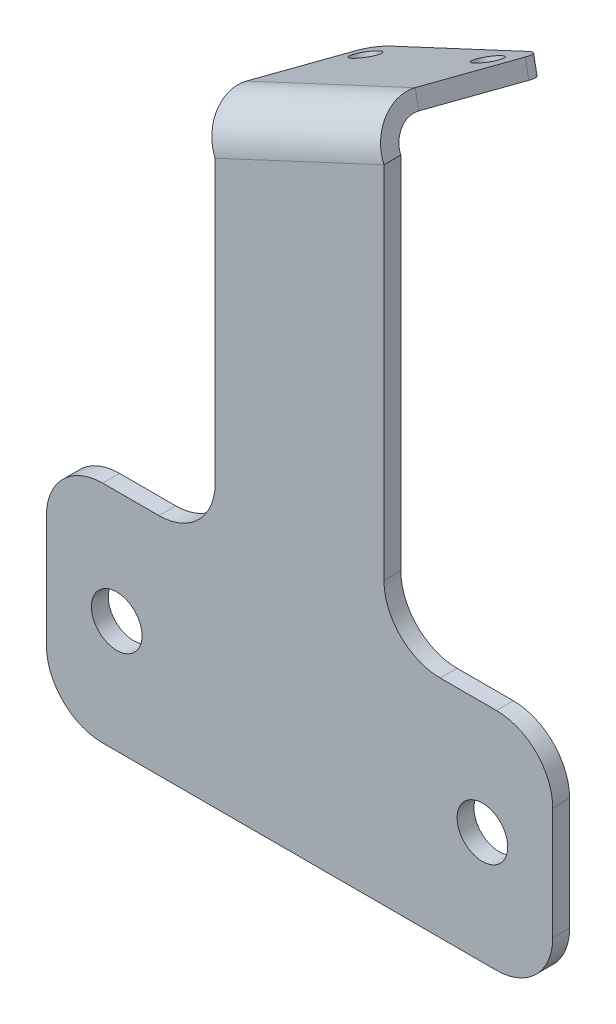
ISO-10303-21;
HEADER;
FILE_DESCRIPTION(('STEP AP214'),'2;1');
FILE_NAME('part.step','',(''),(''),'','','');
FILE_SCHEMA(('AUTOMOTIVE_DESIGN { 1 0 10303 214 1 1 1 1 }'));
ENDSEC;
DATA;
#1=APPLICATION_CONTEXT('core data for automotive mechanical design processes');
#2=APPLICATION_PROTOCOL_DEFINITION('international standard','automotive_design',2000,#1);
#3=PRODUCT_CONTEXT('',#1,'mechanical');
#4=PRODUCT('Part','Part','',(#3));
#5=PRODUCT_RELATED_PRODUCT_CATEGORY('part','',(#4));
#6=PRODUCT_DEFINITION_FORMATION('','',#4);
#7=PRODUCT_DEFINITION_CONTEXT('part definition',#1,'design');
#8=PRODUCT_DEFINITION('design','',#6,#7);
#9=PRODUCT_DEFINITION_SHAPE('','',#8);
#10=(LENGTH_UNIT() NAMED_UNIT(*) SI_UNIT(.MILLI.,.METRE.));
#11=(NAMED_UNIT(*) PLANE_ANGLE_UNIT() SI_UNIT($,.RADIAN.));
#12=(NAMED_UNIT(*) SI_UNIT($,.STERADIAN.) SOLID_ANGLE_UNIT());
#13=UNCERTAINTY_MEASURE_WITH_UNIT(LENGTH_MEASURE(1.E-05),#10,'distance_accuracy_value','');
#14=(GEOMETRIC_REPRESENTATION_CONTEXT(3) GLOBAL_UNCERTAINTY_ASSIGNED_CONTEXT((#13)) GLOBAL_UNIT_ASSIGNED_CONTEXT((#10,
#11,#12)) REPRESENTATION_CONTEXT('',''));
#15=CARTESIAN_POINT('',(0.,0.,0.));
#16=DIRECTION('',(0.,0.,1.));
#17=DIRECTION('',(1.,0.,0.));
#18=AXIS2_PLACEMENT_3D('',#15,#16,#17);
#19=CARTESIAN_POINT('',(15.,40.,-3.));
#20=DIRECTION('',(1.,0.,0.));
#21=DIRECTION('',(0.,0.,1.));
#22=AXIS2_PLACEMENT_3D('',#19,#20,#21);
#23=PLANE('',#22);
#24=DIRECTION('',(0.,-1.,0.));
#25=VECTOR('',#24,1.);
#26=CARTESIAN_POINT('',(15.,40.,-3.));
#27=LINE('',#26,#25);
#28=CARTESIAN_POINT('',(15.,114.,-3.));
#29=VERTEX_POINT('',#28);
#30=CARTESIAN_POINT('',(15.,50.,-3.));
#31=VERTEX_POINT('',#30);
#32=EDGE_CURVE('E245',#29,#31,#27,.T.);
#33=ORIENTED_EDGE('',*,*,#32,.F.);
#34=DIRECTION('',(0.,0.,1.));
#35=VECTOR('',#34,1.);
#36=CARTESIAN_POINT('',(15.,114.,-3.));
#37=LINE('',#36,#35);
#38=CARTESIAN_POINT('',(15.,114.,0.));
#39=VERTEX_POINT('',#38);
#40=EDGE_CURVE('E267',#29,#39,#37,.T.);
#41=ORIENTED_EDGE('',*,*,#40,.T.);
#42=DIRECTION('',(0.,-1.,0.));
#43=VECTOR('',#42,1.);
#44=CARTESIAN_POINT('',(15.,40.,0.));
#45=LINE('',#44,#43);
#46=CARTESIAN_POINT('',(15.,50.,0.));
#47=VERTEX_POINT('',#46);
#48=EDGE_CURVE('E244',#39,#47,#45,.T.);
#49=ORIENTED_EDGE('',*,*,#48,.T.);
#50=DIRECTION('',(0.,0.,1.));
#51=VECTOR('',#50,1.);
#52=CARTESIAN_POINT('',(15.,50.,0.));
#53=LINE('',#52,#51);
#54=EDGE_CURVE('E337',#31,#47,#53,.T.);
#55=ORIENTED_EDGE('',*,*,#54,.F.);
#56=EDGE_LOOP('',(#33,#41,#49,#55));
#57=FACE_BOUND('',#56,.T.);
#58=ADVANCED_FACE('F45',(#57),#23,.T.);
#59=CARTESIAN_POINT('',(-15.,40.,-3.));
#60=DIRECTION('',(-1.,0.,0.));
#61=DIRECTION('',(0.,1.,0.));
#62=AXIS2_PLACEMENT_3D('',#59,#60,#61);
#63=PLANE('',#62);
#64=DIRECTION('',(0.,1.,0.));
#65=VECTOR('',#64,1.);
#66=CARTESIAN_POINT('',(-15.,40.,0.));
#67=LINE('',#66,#65);
#68=CARTESIAN_POINT('',(-15.,50.,0.));
#69=VERTEX_POINT('',#68);
#70=CARTESIAN_POINT('',(-15.,100.01077025535,0.));
#71=VERTEX_POINT('',#70);
#72=EDGE_CURVE('E249',#69,#71,#67,.T.);
#73=ORIENTED_EDGE('',*,*,#72,.T.);
#74=DIRECTION('',(0.,0.,1.));
#75=VECTOR('',#74,1.);
#76=CARTESIAN_POINT('',(-15.,100.01077025535,-3.));
#77=LINE('',#76,#75);
#78=CARTESIAN_POINT('',(-15.,100.01077025535,-3.));
#79=VERTEX_POINT('',#78);
#80=EDGE_CURVE('E216',#79,#71,#77,.T.);
#81=ORIENTED_EDGE('',*,*,#80,.F.);
#82=DIRECTION('',(0.,1.,0.));
#83=VECTOR('',#82,1.);
#84=CARTESIAN_POINT('',(-15.,40.,-3.));
#85=LINE('',#84,#83);
#86=CARTESIAN_POINT('',(-15.,50.,-3.));
#87=VERTEX_POINT('',#86);
#88=EDGE_CURVE('E264',#87,#79,#85,.T.);
#89=ORIENTED_EDGE('',*,*,#88,.F.);
#90=DIRECTION('',(0.,0.,1.));
#91=VECTOR('',#90,1.);
#92=CARTESIAN_POINT('',(-15.,50.,-3.));
#93=LINE('',#92,#91);
#94=EDGE_CURVE('E334',#69,#87,#93,.F.);
#95=ORIENTED_EDGE('',*,*,#94,.F.);
#96=EDGE_LOOP('',(#73,#81,#89,#95));
#97=FACE_BOUND('',#96,.T.);
#98=ADVANCED_FACE('F411',(#97),#63,.T.);
#99=CARTESIAN_POINT('',(-45.,40.,-3.));
#100=DIRECTION('',(0.,1.,0.));
#101=DIRECTION('',(1.,0.,0.));
#102=AXIS2_PLACEMENT_3D('',#99,#100,#101);
#103=PLANE('',#102);
#104=DIRECTION('',(1.,0.,0.));
#105=VECTOR('',#104,1.);
#106=CARTESIAN_POINT('',(-45.,40.,0.));
#107=LINE('',#106,#105);
#108=CARTESIAN_POINT('',(-35.,40.,0.));
#109=VERTEX_POINT('',#108);
#110=CARTESIAN_POINT('',(-25.,40.,0.));
#111=VERTEX_POINT('',#110);
#112=EDGE_CURVE('E282',#109,#111,#107,.T.);
#113=ORIENTED_EDGE('',*,*,#112,.T.);
#114=DIRECTION('',(0.,0.,1.));
#115=VECTOR('',#114,1.);
#116=CARTESIAN_POINT('',(-25.,40.,0.));
#117=LINE('',#116,#115);
#118=CARTESIAN_POINT('',(-25.,40.,-3.));
#119=VERTEX_POINT('',#118);
#120=EDGE_CURVE('E322',#119,#111,#117,.T.);
#121=ORIENTED_EDGE('',*,*,#120,.F.);
#122=DIRECTION('',(1.,0.,0.));
#123=VECTOR('',#122,1.);
#124=CARTESIAN_POINT('',(-45.,40.,-3.));
#125=LINE('',#124,#123);
#126=CARTESIAN_POINT('',(-35.,40.,-3.));
#127=VERTEX_POINT('',#126);
#128=EDGE_CURVE('E261',#127,#119,#125,.T.);
#129=ORIENTED_EDGE('',*,*,#128,.F.);
#130=DIRECTION('',(0.,0.,1.));
#131=VECTOR('',#130,1.);
#132=CARTESIAN_POINT('',(-35.,40.,-3.));
#133=LINE('',#132,#131);
#134=EDGE_CURVE('E325',#109,#127,#133,.F.);
#135=ORIENTED_EDGE('',*,*,#134,.F.);
#136=EDGE_LOOP('',(#113,#121,#129,#135));
#137=FACE_BOUND('',#136,.T.);
#138=ADVANCED_FACE('F417',(#137),#103,.T.);
#139=CARTESIAN_POINT('',(-45.,0.,-3.));
#140=DIRECTION('',(-1.,0.,0.));
#141=DIRECTION('',(0.,1.,0.));
#142=AXIS2_PLACEMENT_3D('',#139,#140,#141);
#143=PLANE('',#142);
#144=DIRECTION('',(0.,1.,0.));
#145=VECTOR('',#144,1.);
#146=CARTESIAN_POINT('',(-45.,0.,0.));
#147=LINE('',#146,#145);
#148=CARTESIAN_POINT('',(-45.,10.,0.));
#149=VERTEX_POINT('',#148);
#150=CARTESIAN_POINT('',(-45.,30.,0.));
#151=VERTEX_POINT('',#150);
#152=EDGE_CURVE('E279',#149,#151,#147,.T.);
#153=ORIENTED_EDGE('',*,*,#152,.T.);
#154=DIRECTION('',(0.,0.,1.));
#155=VECTOR('',#154,1.);
#156=CARTESIAN_POINT('',(-45.,30.,-3.));
#157=LINE('',#156,#155);
#158=CARTESIAN_POINT('',(-45.,30.,-3.));
#159=VERTEX_POINT('',#158);
#160=EDGE_CURVE('E316',#159,#151,#157,.T.);
#161=ORIENTED_EDGE('',*,*,#160,.F.);
#162=DIRECTION('',(0.,1.,0.));
#163=VECTOR('',#162,1.);
#164=CARTESIAN_POINT('',(-45.,0.,-3.));
#165=LINE('',#164,#163);
#166=CARTESIAN_POINT('',(-45.,10.,-3.));
#167=VERTEX_POINT('',#166);
#168=EDGE_CURVE('E258',#167,#159,#165,.T.);
#169=ORIENTED_EDGE('',*,*,#168,.F.);
#170=DIRECTION('',(0.,0.,1.));
#171=VECTOR('',#170,1.);
#172=CARTESIAN_POINT('',(-45.,10.,-3.));
#173=LINE('',#172,#171);
#174=EDGE_CURVE('E319',#149,#167,#173,.F.);
#175=ORIENTED_EDGE('',*,*,#174,.F.);
#176=EDGE_LOOP('',(#153,#161,#169,#175));
#177=FACE_BOUND('',#176,.T.);
#178=ADVANCED_FACE('F493',(#177),#143,.T.);
#179=CARTESIAN_POINT('',(45.,0.,-3.));
#180=DIRECTION('',(0.,-1.,0.));
#181=DIRECTION('',(-1.,0.,0.));
#182=AXIS2_PLACEMENT_3D('',#179,#180,#181);
#183=PLANE('',#182);
#184=DIRECTION('',(-1.,0.,0.));
#185=VECTOR('',#184,1.);
#186=CARTESIAN_POINT('',(45.,0.,0.));
#187=LINE('',#186,#185);
#188=CARTESIAN_POINT('',(35.,0.,0.));
#189=VERTEX_POINT('',#188);
#190=CARTESIAN_POINT('',(-35.,0.,0.));
#191=VERTEX_POINT('',#190);
#192=EDGE_CURVE('E276',#189,#191,#187,.T.);
#193=ORIENTED_EDGE('',*,*,#192,.T.);
#194=DIRECTION('',(0.,0.,1.));
#195=VECTOR('',#194,1.);
#196=CARTESIAN_POINT('',(-35.,0.,-3.));
#197=LINE('',#196,#195);
#198=CARTESIAN_POINT('',(-35.,0.,-3.));
#199=VERTEX_POINT('',#198);
#200=EDGE_CURVE('E302',#199,#191,#197,.T.);
#201=ORIENTED_EDGE('',*,*,#200,.F.);
#202=DIRECTION('',(-1.,0.,0.));
#203=VECTOR('',#202,1.);
#204=CARTESIAN_POINT('',(45.,0.,-3.));
#205=LINE('',#204,#203);
#206=CARTESIAN_POINT('',(35.,0.,-3.));
#207=VERTEX_POINT('',#206);
#208=EDGE_CURVE('E255',#207,#199,#205,.T.);
#209=ORIENTED_EDGE('',*,*,#208,.F.);
#210=DIRECTION('',(0.,0.,1.));
#211=VECTOR('',#210,1.);
#212=CARTESIAN_POINT('',(35.,0.,-3.));
#213=LINE('',#212,#211);
#214=EDGE_CURVE('E305',#189,#207,#213,.F.);
#215=ORIENTED_EDGE('',*,*,#214,.F.);
#216=EDGE_LOOP('',(#193,#201,#209,#215));
#217=FACE_BOUND('',#216,.T.);
#218=ADVANCED_FACE('F486',(#217),#183,.T.);
#219=CARTESIAN_POINT('',(45.,0.,-3.));
#220=DIRECTION('',(1.,0.,0.));
#221=DIRECTION('',(0.,-1.,0.));
#222=AXIS2_PLACEMENT_3D('',#219,#220,#221);
#223=PLANE('',#222);
#224=DIRECTION('',(0.,-1.,0.));
#225=VECTOR('',#224,1.);
#226=CARTESIAN_POINT('',(45.,0.,-3.));
#227=LINE('',#226,#225);
#228=CARTESIAN_POINT('',(45.,30.,-3.));
#229=VERTEX_POINT('',#228);
#230=CARTESIAN_POINT('',(45.,10.,-3.));
#231=VERTEX_POINT('',#230);
#232=EDGE_CURVE('E252',#229,#231,#227,.T.);
#233=ORIENTED_EDGE('',*,*,#232,.F.);
#234=DIRECTION('',(0.,0.,1.));
#235=VECTOR('',#234,1.);
#236=CARTESIAN_POINT('',(45.,30.,-3.));
#237=LINE('',#236,#235);
#238=CARTESIAN_POINT('',(45.,30.,0.));
#239=VERTEX_POINT('',#238);
#240=EDGE_CURVE('E288',#239,#229,#237,.F.);
#241=ORIENTED_EDGE('',*,*,#240,.F.);
#242=DIRECTION('',(0.,-1.,0.));
#243=VECTOR('',#242,1.);
#244=CARTESIAN_POINT('',(45.,0.,0.));
#245=LINE('',#244,#243);
#246=CARTESIAN_POINT('',(45.,10.,0.));
#247=VERTEX_POINT('',#246);
#248=EDGE_CURVE('E273',#239,#247,#245,.T.);
#249=ORIENTED_EDGE('',*,*,#248,.T.);
#250=DIRECTION('',(0.,0.,1.));
#251=VECTOR('',#250,1.);
#252=CARTESIAN_POINT('',(45.,10.,-3.));
#253=LINE('',#252,#251);
#254=EDGE_CURVE('E291',#231,#247,#253,.T.);
#255=ORIENTED_EDGE('',*,*,#254,.F.);
#256=EDGE_LOOP('',(#233,#241,#249,#255));
#257=FACE_BOUND('',#256,.T.);
#258=ADVANCED_FACE('F481',(#257),#223,.T.);
#259=CARTESIAN_POINT('',(45.,40.,-3.));
#260=DIRECTION('',(0.,1.,0.));
#261=DIRECTION('',(0.,0.,1.));
#262=AXIS2_PLACEMENT_3D('',#259,#260,#261);
#263=PLANE('',#262);
#264=DIRECTION('',(1.,0.,0.));
#265=VECTOR('',#264,1.);
#266=CARTESIAN_POINT('',(45.,40.,-3.));
#267=LINE('',#266,#265);
#268=CARTESIAN_POINT('',(25.,40.,-3.));
#269=VERTEX_POINT('',#268);
#270=CARTESIAN_POINT('',(35.,40.,-3.));
#271=VERTEX_POINT('',#270);
#272=EDGE_CURVE('E248',#269,#271,#267,.T.);
#273=ORIENTED_EDGE('',*,*,#272,.F.);
#274=DIRECTION('',(0.,0.,1.));
#275=VECTOR('',#274,1.);
#276=CARTESIAN_POINT('',(25.,40.,-3.));
#277=LINE('',#276,#275);
#278=CARTESIAN_POINT('',(25.,40.,0.));
#279=VERTEX_POINT('',#278);
#280=EDGE_CURVE('E328',#279,#269,#277,.F.);
#281=ORIENTED_EDGE('',*,*,#280,.F.);
#282=DIRECTION('',(1.,0.,0.));
#283=VECTOR('',#282,1.);
#284=CARTESIAN_POINT('',(45.,40.,0.));
#285=LINE('',#284,#283);
#286=CARTESIAN_POINT('',(35.,40.,0.));
#287=VERTEX_POINT('',#286);
#288=EDGE_CURVE('E270',#279,#287,#285,.T.);
#289=ORIENTED_EDGE('',*,*,#288,.T.);
#290=DIRECTION('',(0.,0.,1.));
#291=VECTOR('',#290,1.);
#292=CARTESIAN_POINT('',(35.,40.,-3.));
#293=LINE('',#292,#291);
#294=EDGE_CURVE('E331',#271,#287,#293,.T.);
#295=ORIENTED_EDGE('',*,*,#294,.F.);
#296=EDGE_LOOP('',(#273,#281,#289,#295));
#297=FACE_BOUND('',#296,.T.);
#298=ADVANCED_FACE('F422',(#297),#263,.T.);
#299=CARTESIAN_POINT('',(0.,0.,-3.));
#300=DIRECTION('',(0.,0.,1.));
#301=DIRECTION('',(-1.,0.,0.));
#302=AXIS2_PLACEMENT_3D('',#299,#300,#301);
#303=PLANE('',#302);
#304=CARTESIAN_POINT('',(32.5,20.,-3.));
#305=DIRECTION('',(0.,0.,-1.));
#306=DIRECTION('',(-1.,0.,0.));
#307=AXIS2_PLACEMENT_3D('',#304,#305,#306);
#308=CIRCLE('',#307,4.5);
#309=CARTESIAN_POINT('',(28.,20.,-3.));
#310=VERTEX_POINT('',#309);
#311=EDGE_CURVE('E235',#310,#310,#308,.T.);
#312=ORIENTED_EDGE('',*,*,#311,.F.);
#313=EDGE_LOOP('',(#312));
#314=FACE_BOUND('',#313,.T.);
#315=CARTESIAN_POINT('',(-32.5,20.,-3.));
#316=DIRECTION('',(0.,0.,-1.));
#317=DIRECTION('',(-1.,0.,0.));
#318=AXIS2_PLACEMENT_3D('',#315,#316,#317);
#319=CIRCLE('',#318,4.5);
#320=CARTESIAN_POINT('',(-37.,20.,-3.));
#321=VERTEX_POINT('',#320);
#322=EDGE_CURVE('E241',#321,#321,#319,.T.);
#323=ORIENTED_EDGE('',*,*,#322,.F.);
#324=EDGE_LOOP('',(#323));
#325=FACE_BOUND('',#324,.T.);
#326=ORIENTED_EDGE('',*,*,#208,.T.);
#327=CARTESIAN_POINT('',(-35.,10.,-3.));
#328=DIRECTION('',(0.,0.,-1.));
#329=DIRECTION('',(-1.,0.,0.));
#330=AXIS2_PLACEMENT_3D('',#327,#328,#329);
#331=CIRCLE('',#330,10.);
#332=EDGE_CURVE('E312',#167,#199,#331,.F.);
#333=ORIENTED_EDGE('',*,*,#332,.F.);
#334=ORIENTED_EDGE('',*,*,#168,.T.);
#335=CARTESIAN_POINT('',(-35.,30.,-3.));
#336=DIRECTION('',(0.,0.,-1.));
#337=DIRECTION('',(-1.,0.,0.));
#338=AXIS2_PLACEMENT_3D('',#335,#336,#337);
#339=CIRCLE('',#338,10.);
#340=EDGE_CURVE('E310',#127,#159,#339,.F.);
#341=ORIENTED_EDGE('',*,*,#340,.F.);
#342=ORIENTED_EDGE('',*,*,#128,.T.);
#343=CARTESIAN_POINT('',(-25.,50.,-3.));
#344=DIRECTION('',(0.,0.,-1.));
#345=DIRECTION('',(-1.,0.,0.));
#346=AXIS2_PLACEMENT_3D('',#343,#344,#345);
#347=CIRCLE('',#346,10.);
#348=EDGE_CURVE('E342',#87,#119,#347,.T.);
#349=ORIENTED_EDGE('',*,*,#348,.F.);
#350=ORIENTED_EDGE('',*,*,#88,.T.);
#351=DIRECTION('',(-0.906307787036653,-0.422618261740694,0.));
#352=VECTOR('',#351,1.);
#353=CARTESIAN_POINT('',(15.,114.,-3.));
#354=LINE('',#353,#352);
#355=EDGE_CURVE('E227',#29,#79,#354,.T.);
#356=ORIENTED_EDGE('',*,*,#355,.F.);
#357=ORIENTED_EDGE('',*,*,#32,.T.);
#358=CARTESIAN_POINT('',(25.,50.,-3.));
#359=DIRECTION('',(0.,0.,-1.));
#360=DIRECTION('',(-1.,0.,0.));
#361=AXIS2_PLACEMENT_3D('',#358,#359,#360);
#362=CIRCLE('',#361,10.);
#363=EDGE_CURVE('E346',#269,#31,#362,.T.);
#364=ORIENTED_EDGE('',*,*,#363,.F.);
#365=ORIENTED_EDGE('',*,*,#272,.T.);
#366=CARTESIAN_POINT('',(35.,30.,-3.));
#367=DIRECTION('',(0.,0.,-1.));
#368=DIRECTION('',(-1.,0.,0.));
#369=AXIS2_PLACEMENT_3D('',#366,#367,#368);
#370=CIRCLE('',#369,10.);
#371=EDGE_CURVE('E308',#229,#271,#370,.F.);
#372=ORIENTED_EDGE('',*,*,#371,.F.);
#373=ORIENTED_EDGE('',*,*,#232,.T.);
#374=CARTESIAN_POINT('',(35.,10.,-3.));
#375=DIRECTION('',(0.,0.,-1.));
#376=DIRECTION('',(-1.,0.,0.));
#377=AXIS2_PLACEMENT_3D('',#374,#375,#376);
#378=CIRCLE('',#377,10.);
#379=EDGE_CURVE('E314',#207,#231,#378,.F.);
#380=ORIENTED_EDGE('',*,*,#379,.F.);
#381=EDGE_LOOP('',(#326,#333,#334,#341,#342,#349,#350,#356,#357,#364,#365,#372,#373,#380));
#382=FACE_BOUND('',#381,.T.);
#383=ADVANCED_FACE('F462',(#314,#325,#382),#303,.F.);
#384=CARTESIAN_POINT('',(0.,0.,0.));
#385=DIRECTION('',(0.,0.,1.));
#386=DIRECTION('',(-1.,0.,0.));
#387=AXIS2_PLACEMENT_3D('',#384,#385,#386);
#388=PLANE('',#387);
#389=ORIENTED_EDGE('',*,*,#248,.F.);
#390=CARTESIAN_POINT('',(35.,30.,0.));
#391=DIRECTION('',(0.,0.,-1.));
#392=DIRECTION('',(-1.,0.,0.));
#393=AXIS2_PLACEMENT_3D('',#390,#391,#392);
#394=CIRCLE('',#393,10.);
#395=EDGE_CURVE('E294',#287,#239,#394,.T.);
#396=ORIENTED_EDGE('',*,*,#395,.F.);
#397=ORIENTED_EDGE('',*,*,#288,.F.);
#398=CARTESIAN_POINT('',(25.,50.,0.));
#399=DIRECTION('',(0.,0.,-1.));
#400=DIRECTION('',(-1.,0.,0.));
#401=AXIS2_PLACEMENT_3D('',#398,#399,#400);
#402=CIRCLE('',#401,10.);
#403=EDGE_CURVE('E344',#47,#279,#402,.F.);
#404=ORIENTED_EDGE('',*,*,#403,.F.);
#405=ORIENTED_EDGE('',*,*,#48,.F.);
#406=DIRECTION('',(-0.906307787036653,-0.422618261740694,0.));
#407=VECTOR('',#406,1.);
#408=CARTESIAN_POINT('',(15.,114.,0.));
#409=LINE('',#408,#407);
#410=EDGE_CURVE('E220',#39,#71,#409,.T.);
#411=ORIENTED_EDGE('',*,*,#410,.T.);
#412=ORIENTED_EDGE('',*,*,#72,.F.);
#413=CARTESIAN_POINT('',(-25.,50.,0.));
#414=DIRECTION('',(0.,0.,-1.));
#415=DIRECTION('',(-1.,0.,0.));
#416=AXIS2_PLACEMENT_3D('',#413,#414,#415);
#417=CIRCLE('',#416,10.);
#418=EDGE_CURVE('E340',#111,#69,#417,.F.);
#419=ORIENTED_EDGE('',*,*,#418,.F.);
#420=ORIENTED_EDGE('',*,*,#112,.F.);
#421=CARTESIAN_POINT('',(-35.,30.,0.));
#422=DIRECTION('',(0.,0.,-1.));
#423=DIRECTION('',(-1.,0.,0.));
#424=AXIS2_PLACEMENT_3D('',#421,#422,#423);
#425=CIRCLE('',#424,10.);
#426=EDGE_CURVE('E296',#151,#109,#425,.T.);
#427=ORIENTED_EDGE('',*,*,#426,.F.);
#428=ORIENTED_EDGE('',*,*,#152,.F.);
#429=CARTESIAN_POINT('',(-35.,10.,0.));
#430=DIRECTION('',(0.,0.,-1.));
#431=DIRECTION('',(-1.,0.,0.));
#432=AXIS2_PLACEMENT_3D('',#429,#430,#431);
#433=CIRCLE('',#432,10.);
#434=EDGE_CURVE('E298',#191,#149,#433,.T.);
#435=ORIENTED_EDGE('',*,*,#434,.F.);
#436=ORIENTED_EDGE('',*,*,#192,.F.);
#437=CARTESIAN_POINT('',(35.,10.,0.));
#438=DIRECTION('',(0.,0.,-1.));
#439=DIRECTION('',(-1.,0.,0.));
#440=AXIS2_PLACEMENT_3D('',#437,#438,#439);
#441=CIRCLE('',#440,10.);
#442=EDGE_CURVE('E300',#247,#189,#441,.T.);
#443=ORIENTED_EDGE('',*,*,#442,.F.);
#444=EDGE_LOOP('',(#389,#396,#397,#404,#405,#411,#412,#419,#420,#427,#428,#435,#436,#443));
#445=FACE_BOUND('',#444,.T.);
#446=CARTESIAN_POINT('',(32.5,20.,0.));
#447=DIRECTION('',(0.,0.,-1.));
#448=DIRECTION('',(-1.,0.,0.));
#449=AXIS2_PLACEMENT_3D('',#446,#447,#448);
#450=CIRCLE('',#449,4.5);
#451=CARTESIAN_POINT('',(28.,20.,0.));
#452=VERTEX_POINT('',#451);
#453=EDGE_CURVE('E232',#452,#452,#450,.T.);
#454=ORIENTED_EDGE('',*,*,#453,.T.);
#455=EDGE_LOOP('',(#454));
#456=FACE_BOUND('',#455,.T.);
#457=CARTESIAN_POINT('',(-32.5,20.,0.));
#458=DIRECTION('',(0.,0.,-1.));
#459=DIRECTION('',(-1.,0.,0.));
#460=AXIS2_PLACEMENT_3D('',#457,#458,#459);
#461=CIRCLE('',#460,4.5);
#462=CARTESIAN_POINT('',(-37.,20.,0.));
#463=VERTEX_POINT('',#462);
#464=EDGE_CURVE('E238',#463,#463,#461,.T.);
#465=ORIENTED_EDGE('',*,*,#464,.T.);
#466=EDGE_LOOP('',(#465));
#467=FACE_BOUND('',#466,.T.);
#468=ADVANCED_FACE('F468',(#445,#456,#467),#388,.T.);
#469=CARTESIAN_POINT('',(-32.5,20.,0.));
#470=DIRECTION('',(0.,0.,1.));
#471=DIRECTION('',(-1.,0.,0.));
#472=AXIS2_PLACEMENT_3D('',#469,#470,#471);
#473=CYLINDRICAL_SURFACE('',#472,4.5);
#474=ORIENTED_EDGE('',*,*,#322,.T.);
#475=EDGE_LOOP('',(#474));
#476=FACE_BOUND('',#475,.T.);
#477=ORIENTED_EDGE('',*,*,#464,.F.);
#478=EDGE_LOOP('',(#477));
#479=FACE_BOUND('',#478,.T.);
#480=ADVANCED_FACE('F519',(#476,#479),#473,.F.);
#481=CARTESIAN_POINT('',(32.5,20.,0.));
#482=DIRECTION('',(0.,0.,1.));
#483=DIRECTION('',(-1.,0.,0.));
#484=AXIS2_PLACEMENT_3D('',#481,#482,#483);
#485=CYLINDRICAL_SURFACE('',#484,4.5);
#486=ORIENTED_EDGE('',*,*,#311,.T.);
#487=EDGE_LOOP('',(#486));
#488=FACE_BOUND('',#487,.T.);
#489=ORIENTED_EDGE('',*,*,#453,.F.);
#490=EDGE_LOOP('',(#489));
#491=FACE_BOUND('',#490,.T.);
#492=ADVANCED_FACE('F525',(#488,#491),#485,.F.);
#493=CARTESIAN_POINT('',(15.,114.,-7.));
#494=DIRECTION('',(0.906307787036652,0.422618261740694,0.));
#495=DIRECTION('',(0.422618261740694,-0.906307787036652,0.));
#496=AXIS2_PLACEMENT_3D('',#493,#494,#495);
#497=PLANE('',#496);
#498=DIRECTION('',(-0.413383038747951,0.886502787416267,-0.207911690817757));
#499=VECTOR('',#498,1.);
#500=CARTESIAN_POINT('',(12.1063187287644,120.205519511914,-8.4553818357243));
#501=LINE('',#500,#499);
#502=CARTESIAN_POINT('',(13.3464678450082,117.546011149665,-7.83164676327102));
#503=VERTEX_POINT('',#502);
#504=CARTESIAN_POINT('',(12.1063187287643,120.205519511914,-8.45538183572429));
#505=VERTEX_POINT('',#504);
#506=EDGE_CURVE('E375',#503,#505,#501,.T.);
#507=ORIENTED_EDGE('',*,*,#506,.T.);
#508=CARTESIAN_POINT('',(15.,114.,-7.));
#509=DIRECTION('',(0.906307787036652,0.422618261740694,0.));
#510=DIRECTION('',(-0.422618261740694,0.906307787036652,0.));
#511=AXIS2_PLACEMENT_3D('',#508,#509,#510);
#512=CIRCLE('',#511,6.99999999999999);
#513=EDGE_CURVE('E199',#39,#505,#512,.F.);
#514=ORIENTED_EDGE('',*,*,#513,.F.);
#515=ORIENTED_EDGE('',*,*,#40,.F.);
#516=CARTESIAN_POINT('',(15.,114.,-7.));
#517=DIRECTION('',(0.906307787036652,0.422618261740694,0.));
#518=DIRECTION('',(-0.422618261740694,0.906307787036652,0.));
#519=AXIS2_PLACEMENT_3D('',#516,#517,#518);
#520=CIRCLE('',#519,3.99999999999999);
#521=EDGE_CURVE('E218',#29,#503,#520,.F.);
#522=ORIENTED_EDGE('',*,*,#521,.T.);
#523=EDGE_LOOP('',(#507,#514,#515,#522));
#524=FACE_BOUND('',#523,.T.);
#525=ADVANCED_FACE('F459',(#524),#497,.T.);
#526=CARTESIAN_POINT('',(-15.,100.01077025535,-7.));
#527=DIRECTION('',(0.906307787036652,0.422618261740694,0.));
#528=DIRECTION('',(0.422618261740694,-0.906307787036652,0.));
#529=AXIS2_PLACEMENT_3D('',#526,#527,#528);
#530=PLANE('',#529);
#531=CARTESIAN_POINT('',(-15.,100.01077025535,-7.));
#532=DIRECTION('',(0.906307787036652,0.422618261740694,0.));
#533=DIRECTION('',(-0.422618261740694,0.906307787036652,0.));
#534=AXIS2_PLACEMENT_3D('',#531,#532,#533);
#535=CIRCLE('',#534,3.99999999999999);
#536=CARTESIAN_POINT('',(-16.6535321549918,103.556781405015,-7.83164676327102));
#537=VERTEX_POINT('',#536);
#538=EDGE_CURVE('E190',#537,#79,#535,.T.);
#539=ORIENTED_EDGE('',*,*,#538,.T.);
#540=ORIENTED_EDGE('',*,*,#80,.T.);
#541=CARTESIAN_POINT('',(-15.,100.01077025535,-7.));
#542=DIRECTION('',(0.906307787036652,0.422618261740694,0.));
#543=DIRECTION('',(-0.422618261740694,0.906307787036652,0.));
#544=AXIS2_PLACEMENT_3D('',#541,#542,#543);
#545=CIRCLE('',#544,6.99999999999999);
#546=CARTESIAN_POINT('',(-17.8936812712357,106.216289767264,-8.4553818357243));
#547=VERTEX_POINT('',#546);
#548=EDGE_CURVE('E197',#547,#71,#545,.T.);
#549=ORIENTED_EDGE('',*,*,#548,.F.);
#550=DIRECTION('',(-0.413383038747951,0.886502787416267,-0.207911690817757));
#551=VECTOR('',#550,1.);
#552=CARTESIAN_POINT('',(-16.6535321549918,103.556781405015,-7.83164676327103));
#553=LINE('',#552,#551);
#554=EDGE_CURVE('E202',#537,#547,#553,.T.);
#555=ORIENTED_EDGE('',*,*,#554,.F.);
#556=EDGE_LOOP('',(#539,#540,#549,#555));
#557=FACE_BOUND('',#556,.T.);
#558=ADVANCED_FACE('F214',(#557),#530,.F.);
#559=CARTESIAN_POINT('',(-15.,100.01077025535,-7.));
#560=DIRECTION('',(-0.906307787036652,-0.422618261740694,0.));
#561=DIRECTION('',(-0.413383038747951,0.886502787416267,-0.207911690817756));
#562=AXIS2_PLACEMENT_3D('',#559,#560,#561);
#563=CYLINDRICAL_SURFACE('',#562,6.99999999999999);
#564=ORIENTED_EDGE('',*,*,#410,.F.);
#565=ORIENTED_EDGE('',*,*,#513,.T.);
#566=DIRECTION('',(-0.906307787036653,-0.422618261740693,0.));
#567=VECTOR('',#566,1.);
#568=CARTESIAN_POINT('',(-43.879121601666,94.0990799406549,-8.4553818357243));
#569=LINE('',#568,#567);
#570=EDGE_CURVE('E185',#505,#547,#569,.T.);
#571=ORIENTED_EDGE('',*,*,#570,.T.);
#572=ORIENTED_EDGE('',*,*,#548,.T.);
#573=EDGE_LOOP('',(#564,#565,#571,#572));
#574=FACE_BOUND('',#573,.T.);
#575=ADVANCED_FACE('F195',(#574),#563,.T.);
#576=CARTESIAN_POINT('',(-15.,100.01077025535,-7.));
#577=DIRECTION('',(-0.906307787036652,-0.422618261740694,0.));
#578=DIRECTION('',(-0.413383038747951,0.886502787416267,-0.207911690817756));
#579=AXIS2_PLACEMENT_3D('',#576,#577,#578);
#580=CYLINDRICAL_SURFACE('',#579,3.99999999999999);
#581=ORIENTED_EDGE('',*,*,#355,.T.);
#582=ORIENTED_EDGE('',*,*,#538,.F.);
#583=DIRECTION('',(0.906307787036653,0.422618261740693,0.));
#584=VECTOR('',#583,1.);
#585=CARTESIAN_POINT('',(13.3464678450082,117.546011149665,-7.83164676327103));
#586=LINE('',#585,#584);
#587=EDGE_CURVE('E211',#503,#537,#586,.F.);
#588=ORIENTED_EDGE('',*,*,#587,.F.);
#589=ORIENTED_EDGE('',*,*,#521,.F.);
#590=EDGE_LOOP('',(#581,#582,#588,#589));
#591=FACE_BOUND('',#590,.T.);
#592=ADVANCED_FACE('F456',(#591),#580,.F.);
#593=CARTESIAN_POINT('',(-18.3277094751373,107.147066254228,-3.62373507245327));
#594=DIRECTION('',(-0.906307787036652,-0.422618261740694,0.));
#595=DIRECTION('',(-0.422618261740694,0.906307787036653,0.));
#596=AXIS2_PLACEMENT_3D('',#593,#594,#595);
#597=PLANE('',#596);
#598=DIRECTION('',(0.0878672773689687,-0.18843198440409,-0.978147600733806));
#599=VECTOR('',#598,1.);
#600=CARTESIAN_POINT('',(-15.573713114976,101.241102000803,-19.8523037683003));
#601=LINE('',#600,#599);
#602=CARTESIAN_POINT('',(-15.0406650228576,100.097976678291,-25.7862501473595));
#603=VERTEX_POINT('',#602);
#604=EDGE_CURVE('E207',#603,#537,#601,.F.);
#605=ORIENTED_EDGE('',*,*,#604,.T.);
#606=ORIENTED_EDGE('',*,*,#554,.T.);
#607=DIRECTION('',(-0.0878672773689687,0.18843198440409,0.978147600733806));
#608=VECTOR('',#607,1.);
#609=CARTESIAN_POINT('',(-18.3277094751373,107.147066254228,-3.62373507245327));
#610=LINE('',#609,#608);
#611=CARTESIAN_POINT('',(-16.2808141391014,102.75748504054,-26.4099852198128));
#612=VERTEX_POINT('',#611);
#613=EDGE_CURVE('E181',#612,#547,#610,.T.);
#614=ORIENTED_EDGE('',*,*,#613,.F.);
#615=DIRECTION('',(0.413383038747951,-0.886502787416267,0.207911690817756));
#616=VECTOR('',#615,1.);
#617=CARTESIAN_POINT('',(-16.2808141391014,102.75748504054,-26.4099852198128));
#618=LINE('',#617,#616);
#619=EDGE_CURVE('E11',#603,#612,#618,.F.);
#620=ORIENTED_EDGE('',*,*,#619,.F.);
#621=EDGE_LOOP('',(#605,#606,#614,#620));
#622=FACE_BOUND('',#621,.T.);
#623=ADVANCED_FACE('F205',(#622),#597,.T.);
#624=CARTESIAN_POINT('',(13.9827876930055,116.181418831977,-29.3444280220142));
#625=DIRECTION('',(0.906307787036653,0.422618261740694,0.));
#626=DIRECTION('',(0.422618261740694,-0.906307787036653,0.));
#627=AXIS2_PLACEMENT_3D('',#624,#625,#626);
#628=PLANE('',#627);
#629=DIRECTION('',(0.0878672773689689,-0.18843198440409,-0.978147600733806));
#630=VECTOR('',#629,1.);
#631=CARTESIAN_POINT('',(13.9827876930055,116.181418831977,-29.3444280220142));
#632=LINE('',#631,#630);
#633=CARTESIAN_POINT('',(13.7191858608986,116.74671478519,-26.4099852198128));
#634=VERTEX_POINT('',#633);
#635=EDGE_CURVE('E367',#505,#634,#632,.T.);
#636=ORIENTED_EDGE('',*,*,#635,.F.);
#637=ORIENTED_EDGE('',*,*,#506,.F.);
#638=DIRECTION('',(-0.0878672773689689,0.18843198440409,0.978147600733806));
#639=VECTOR('',#638,1.);
#640=CARTESIAN_POINT('',(14.426286885024,115.230331745453,-19.8523037683003));
#641=LINE('',#640,#639);
#642=CARTESIAN_POINT('',(14.9593349771425,114.087206422941,-25.7862501473595));
#643=VERTEX_POINT('',#642);
#644=EDGE_CURVE('E201',#503,#643,#641,.F.);
#645=ORIENTED_EDGE('',*,*,#644,.T.);
#646=DIRECTION('',(0.413383038747951,-0.886502787416267,0.207911690817756));
#647=VECTOR('',#646,1.);
#648=CARTESIAN_POINT('',(13.7191858608986,116.74671478519,-26.4099852198128));
#649=LINE('',#648,#647);
#650=EDGE_CURVE('E348',#634,#643,#649,.T.);
#651=ORIENTED_EDGE('',*,*,#650,.F.);
#652=EDGE_LOOP('',(#636,#637,#645,#651));
#653=FACE_BOUND('',#652,.T.);
#654=ADVANCED_FACE('F365',(#653),#628,.T.);
#655=CARTESIAN_POINT('',(-42.7993025616502,91.783400536443,-20.4760388407535));
#656=DIRECTION('',(-0.413383038747951,0.886502787416267,-0.207911690817756));
#657=DIRECTION('',(0.906307787036653,0.422618261740693,0.));
#658=AXIS2_PLACEMENT_3D('',#655,#656,#657);
#659=PLANE('',#658);
#660=CARTESIAN_POINT('',(9.01191237097738,115.010487445294,-24.4536900183452));
#661=DIRECTION('',(0.413383038747951,-0.886502787416267,0.207911690817756));
#662=DIRECTION('',(0.906307787036653,0.422618261740693,0.));
#663=AXIS2_PLACEMENT_3D('',#660,#661,#662);
#664=CIRCLE('',#663,2.25);
#665=CARTESIAN_POINT('',(11.0511048918098,115.961378534211,-24.4536900183452));
#666=VERTEX_POINT('',#665);
#667=EDGE_CURVE('E389',#666,#666,#664,.T.);
#668=ORIENTED_EDGE('',*,*,#667,.T.);
#669=EDGE_LOOP('',(#668));
#670=FACE_BOUND('',#669,.T.);
#671=CARTESIAN_POINT('',(-12.7394745179023,104.867649163518,-24.4536900183452));
#672=DIRECTION('',(0.413383038747951,-0.886502787416267,0.207911690817756));
#673=DIRECTION('',(0.906307787036653,0.422618261740693,0.));
#674=AXIS2_PLACEMENT_3D('',#671,#672,#673);
#675=CIRCLE('',#674,2.25);
#676=CARTESIAN_POINT('',(-10.7002819970698,105.818540252434,-24.4536900183452));
#677=VERTEX_POINT('',#676);
#678=EDGE_CURVE('E379',#677,#677,#675,.T.);
#679=ORIENTED_EDGE('',*,*,#678,.T.);
#680=EDGE_LOOP('',(#679));
#681=FACE_BOUND('',#680,.T.);
#682=DIRECTION('',(-0.906307787036653,-0.422618261740693,0.));
#683=VECTOR('',#682,1.);
#684=CARTESIAN_POINT('',(-16.0172123069945,102.192189087328,-29.3444280220142));
#685=LINE('',#684,#683);
#686=CARTESIAN_POINT('',(11.2638643318956,114.913564046755,-29.3444280220142));
#687=VERTEX_POINT('',#686);
#688=CARTESIAN_POINT('',(-13.2982889458846,103.46004387255,-29.3444280220142));
#689=VERTEX_POINT('',#688);
#690=EDGE_CURVE('E191',#687,#689,#685,.T.);
#691=ORIENTED_EDGE('',*,*,#690,.T.);
#692=CARTESIAN_POINT('',(-13.5618907779915,104.025339825762,-26.4099852198128));
#693=DIRECTION('',(0.413383038747951,-0.886502787416267,0.207911690817756));
#694=DIRECTION('',(0.906307787036653,0.422618261740693,0.));
#695=AXIS2_PLACEMENT_3D('',#692,#693,#694);
#696=CIRCLE('',#695,3.);
#697=EDGE_CURVE('E60',#612,#689,#696,.T.);
#698=ORIENTED_EDGE('',*,*,#697,.F.);
#699=ORIENTED_EDGE('',*,*,#613,.T.);
#700=ORIENTED_EDGE('',*,*,#570,.F.);
#701=ORIENTED_EDGE('',*,*,#635,.T.);
#702=CARTESIAN_POINT('',(11.0002624997887,115.478859999967,-26.4099852198128));
#703=DIRECTION('',(0.413383038747951,-0.886502787416267,0.207911690817756));
#704=DIRECTION('',(0.906307787036653,0.422618261740693,0.));
#705=AXIS2_PLACEMENT_3D('',#702,#703,#704);
#706=CIRCLE('',#705,3.);
#707=EDGE_CURVE('E53',#687,#634,#706,.T.);
#708=ORIENTED_EDGE('',*,*,#707,.F.);
#709=EDGE_LOOP('',(#691,#698,#699,#700,#701,#708));
#710=FACE_BOUND('',#709,.T.);
#711=ADVANCED_FACE('F183',(#670,#681,#710),#659,.T.);
#712=CARTESIAN_POINT('',(-41.5591534454064,89.1238921741942,-19.8523037683003));
#713=DIRECTION('',(-0.413383038747951,0.886502787416267,-0.207911690817756));
#714=DIRECTION('',(0.906307787036653,0.422618261740693,0.));
#715=AXIS2_PLACEMENT_3D('',#712,#713,#714);
#716=PLANE('',#715);
#717=CARTESIAN_POINT('',(10.2520614872213,112.350979083045,-23.8299549458919));
#718=DIRECTION('',(0.413383038747951,-0.886502787416267,0.207911690817756));
#719=DIRECTION('',(0.906307787036653,0.422618261740693,0.));
#720=AXIS2_PLACEMENT_3D('',#717,#718,#719);
#721=CIRCLE('',#720,2.25);
#722=CARTESIAN_POINT('',(12.2912540080537,113.301870171962,-23.8299549458919));
#723=VERTEX_POINT('',#722);
#724=EDGE_CURVE('E384',#723,#723,#721,.T.);
#725=ORIENTED_EDGE('',*,*,#724,.F.);
#726=EDGE_LOOP('',(#725));
#727=FACE_BOUND('',#726,.T.);
#728=CARTESIAN_POINT('',(-11.4993254016584,102.208140801269,-23.8299549458919));
#729=DIRECTION('',(0.413383038747951,-0.886502787416267,0.207911690817756));
#730=DIRECTION('',(0.906307787036653,0.422618261740693,0.));
#731=AXIS2_PLACEMENT_3D('',#728,#729,#730);
#732=CIRCLE('',#731,2.25);
#733=CARTESIAN_POINT('',(-9.46013288082595,103.159031890185,-23.8299549458919));
#734=VERTEX_POINT('',#733);
#735=EDGE_CURVE('E376',#734,#734,#732,.T.);
#736=ORIENTED_EDGE('',*,*,#735,.F.);
#737=EDGE_LOOP('',(#736));
#738=FACE_BOUND('',#737,.T.);
#739=ORIENTED_EDGE('',*,*,#644,.F.);
#740=ORIENTED_EDGE('',*,*,#587,.T.);
#741=ORIENTED_EDGE('',*,*,#604,.F.);
#742=CARTESIAN_POINT('',(-12.3217416617476,101.365831463513,-25.7862501473595));
#743=DIRECTION('',(0.413383038747951,-0.886502787416267,0.207911690817756));
#744=DIRECTION('',(0.906307787036653,0.422618261740693,0.));
#745=AXIS2_PLACEMENT_3D('',#742,#743,#744);
#746=CIRCLE('',#745,3.);
#747=CARTESIAN_POINT('',(-12.0581398296407,100.800535510301,-28.7206929495609));
#748=VERTEX_POINT('',#747);
#749=EDGE_CURVE('E351',#748,#603,#746,.F.);
#750=ORIENTED_EDGE('',*,*,#749,.F.);
#751=DIRECTION('',(0.906307787036653,0.422618261740693,0.));
#752=VECTOR('',#751,1.);
#753=CARTESIAN_POINT('',(-40.762503521181,87.4154708984695,-28.7206929495609));
#754=LINE('',#753,#752);
#755=CARTESIAN_POINT('',(12.5040134481394,112.254055684506,-28.7206929495609));
#756=VERTEX_POINT('',#755);
#757=EDGE_CURVE('E370',#756,#748,#754,.F.);
#758=ORIENTED_EDGE('',*,*,#757,.F.);
#759=CARTESIAN_POINT('',(12.2404116160325,112.819351637719,-25.7862501473595));
#760=DIRECTION('',(0.413383038747951,-0.886502787416267,0.207911690817756));
#761=DIRECTION('',(0.906307787036653,0.422618261740693,0.));
#762=AXIS2_PLACEMENT_3D('',#759,#760,#761);
#763=CIRCLE('',#762,3.);
#764=EDGE_CURVE('E353',#643,#756,#763,.F.);
#765=ORIENTED_EDGE('',*,*,#764,.F.);
#766=EDGE_LOOP('',(#739,#740,#741,#750,#758,#765));
#767=FACE_BOUND('',#766,.T.);
#768=ADVANCED_FACE('F453',(#727,#738,#767),#716,.F.);
#769=CARTESIAN_POINT('',(-16.0172123069945,102.192189087328,-29.3444280220142));
#770=DIRECTION('',(0.0878672773689688,-0.18843198440409,-0.978147600733806));
#771=DIRECTION('',(0.,0.981945578867913,-0.189163633243177));
#772=AXIS2_PLACEMENT_3D('',#769,#770,#771);
#773=PLANE('',#772);
#774=ORIENTED_EDGE('',*,*,#757,.T.);
#775=DIRECTION('',(0.413383038747951,-0.886502787416267,0.207911690817756));
#776=VECTOR('',#775,1.);
#777=CARTESIAN_POINT('',(-13.2982889458846,103.46004387255,-29.3444280220142));
#778=LINE('',#777,#776);
#779=EDGE_CURVE('E67',#689,#748,#778,.T.);
#780=ORIENTED_EDGE('',*,*,#779,.F.);
#781=ORIENTED_EDGE('',*,*,#690,.F.);
#782=DIRECTION('',(0.413383038747951,-0.886502787416267,0.207911690817756));
#783=VECTOR('',#782,1.);
#784=CARTESIAN_POINT('',(11.2638643318956,114.913564046755,-29.3444280220142));
#785=LINE('',#784,#783);
#786=EDGE_CURVE('E357',#756,#687,#785,.F.);
#787=ORIENTED_EDGE('',*,*,#786,.F.);
#788=EDGE_LOOP('',(#774,#780,#781,#787));
#789=FACE_BOUND('',#788,.T.);
#790=ADVANCED_FACE('F408',(#789),#773,.T.);
#791=CARTESIAN_POINT('',(-12.7394745179023,104.867649163518,-24.4536900183452));
#792=DIRECTION('',(-0.413383038747951,0.886502787416267,-0.207911690817756));
#793=DIRECTION('',(0.906307787036653,0.422618261740693,0.));
#794=AXIS2_PLACEMENT_3D('',#791,#792,#793);
#795=CYLINDRICAL_SURFACE('',#794,2.25);
#796=ORIENTED_EDGE('',*,*,#735,.T.);
#797=EDGE_LOOP('',(#796));
#798=FACE_BOUND('',#797,.T.);
#799=ORIENTED_EDGE('',*,*,#678,.F.);
#800=EDGE_LOOP('',(#799));
#801=FACE_BOUND('',#800,.T.);
#802=ADVANCED_FACE('F398',(#798,#801),#795,.F.);
#803=CARTESIAN_POINT('',(9.01191237097738,115.010487445294,-24.4536900183452));
#804=DIRECTION('',(-0.413383038747951,0.886502787416267,-0.207911690817756));
#805=DIRECTION('',(0.906307787036653,0.422618261740693,0.));
#806=AXIS2_PLACEMENT_3D('',#803,#804,#805);
#807=CYLINDRICAL_SURFACE('',#806,2.25);
#808=ORIENTED_EDGE('',*,*,#724,.T.);
#809=EDGE_LOOP('',(#808));
#810=FACE_BOUND('',#809,.T.);
#811=ORIENTED_EDGE('',*,*,#667,.F.);
#812=EDGE_LOOP('',(#811));
#813=FACE_BOUND('',#812,.T.);
#814=ADVANCED_FACE('F395',(#810,#813),#807,.F.);
#815=CARTESIAN_POINT('',(35.,10.,-3.));
#816=DIRECTION('',(0.,0.,1.));
#817=DIRECTION('',(-1.,0.,0.));
#818=AXIS2_PLACEMENT_3D('',#815,#816,#817);
#819=CYLINDRICAL_SURFACE('',#818,10.);
#820=ORIENTED_EDGE('',*,*,#379,.T.);
#821=ORIENTED_EDGE('',*,*,#254,.T.);
#822=ORIENTED_EDGE('',*,*,#442,.T.);
#823=ORIENTED_EDGE('',*,*,#214,.T.);
#824=EDGE_LOOP('',(#820,#821,#822,#823));
#825=FACE_BOUND('',#824,.T.);
#826=ADVANCED_FACE('F397',(#825),#819,.T.);
#827=CARTESIAN_POINT('',(-35.,10.,-3.));
#828=DIRECTION('',(0.,0.,1.));
#829=DIRECTION('',(-1.,0.,0.));
#830=AXIS2_PLACEMENT_3D('',#827,#828,#829);
#831=CYLINDRICAL_SURFACE('',#830,10.);
#832=ORIENTED_EDGE('',*,*,#332,.T.);
#833=ORIENTED_EDGE('',*,*,#200,.T.);
#834=ORIENTED_EDGE('',*,*,#434,.T.);
#835=ORIENTED_EDGE('',*,*,#174,.T.);
#836=EDGE_LOOP('',(#832,#833,#834,#835));
#837=FACE_BOUND('',#836,.T.);
#838=ADVANCED_FACE('F405',(#837),#831,.T.);
#839=CARTESIAN_POINT('',(-35.,30.,-3.));
#840=DIRECTION('',(0.,0.,1.));
#841=DIRECTION('',(-1.,0.,0.));
#842=AXIS2_PLACEMENT_3D('',#839,#840,#841);
#843=CYLINDRICAL_SURFACE('',#842,10.);
#844=ORIENTED_EDGE('',*,*,#340,.T.);
#845=ORIENTED_EDGE('',*,*,#160,.T.);
#846=ORIENTED_EDGE('',*,*,#426,.T.);
#847=ORIENTED_EDGE('',*,*,#134,.T.);
#848=EDGE_LOOP('',(#844,#845,#846,#847));
#849=FACE_BOUND('',#848,.T.);
#850=ADVANCED_FACE('F427',(#849),#843,.T.);
#851=CARTESIAN_POINT('',(35.,30.,-3.));
#852=DIRECTION('',(0.,0.,1.));
#853=DIRECTION('',(-1.,0.,0.));
#854=AXIS2_PLACEMENT_3D('',#851,#852,#853);
#855=CYLINDRICAL_SURFACE('',#854,10.);
#856=ORIENTED_EDGE('',*,*,#371,.T.);
#857=ORIENTED_EDGE('',*,*,#294,.T.);
#858=ORIENTED_EDGE('',*,*,#395,.T.);
#859=ORIENTED_EDGE('',*,*,#240,.T.);
#860=EDGE_LOOP('',(#856,#857,#858,#859));
#861=FACE_BOUND('',#860,.T.);
#862=ADVANCED_FACE('F431',(#861),#855,.T.);
#863=CARTESIAN_POINT('',(-25.,50.,-3.));
#864=DIRECTION('',(0.,0.,-1.));
#865=DIRECTION('',(1.,0.,0.));
#866=AXIS2_PLACEMENT_3D('',#863,#864,#865);
#867=CYLINDRICAL_SURFACE('',#866,10.);
#868=ORIENTED_EDGE('',*,*,#348,.T.);
#869=ORIENTED_EDGE('',*,*,#120,.T.);
#870=ORIENTED_EDGE('',*,*,#418,.T.);
#871=ORIENTED_EDGE('',*,*,#94,.T.);
#872=EDGE_LOOP('',(#868,#869,#870,#871));
#873=FACE_BOUND('',#872,.T.);
#874=ADVANCED_FACE('F435',(#873),#867,.F.);
#875=CARTESIAN_POINT('',(25.,50.,-3.));
#876=DIRECTION('',(0.,0.,-1.));
#877=DIRECTION('',(1.,0.,0.));
#878=AXIS2_PLACEMENT_3D('',#875,#876,#877);
#879=CYLINDRICAL_SURFACE('',#878,10.);
#880=ORIENTED_EDGE('',*,*,#363,.T.);
#881=ORIENTED_EDGE('',*,*,#54,.T.);
#882=ORIENTED_EDGE('',*,*,#403,.T.);
#883=ORIENTED_EDGE('',*,*,#280,.T.);
#884=EDGE_LOOP('',(#880,#881,#882,#883));
#885=FACE_BOUND('',#884,.T.);
#886=ADVANCED_FACE('F439',(#885),#879,.F.);
#887=CARTESIAN_POINT('',(11.0002624997886,115.478859999967,-26.4099852198128));
#888=DIRECTION('',(0.413383038747951,-0.886502787416267,0.207911690817756));
#889=DIRECTION('',(-0.906307787036653,-0.422618261740694,0.));
#890=AXIS2_PLACEMENT_3D('',#887,#888,#889);
#891=CYLINDRICAL_SURFACE('',#890,3.);
#892=ORIENTED_EDGE('',*,*,#707,.T.);
#893=ORIENTED_EDGE('',*,*,#650,.T.);
#894=ORIENTED_EDGE('',*,*,#764,.T.);
#895=ORIENTED_EDGE('',*,*,#786,.T.);
#896=EDGE_LOOP('',(#892,#893,#894,#895));
#897=FACE_BOUND('',#896,.T.);
#898=ADVANCED_FACE('F362',(#897),#891,.T.);
#899=CARTESIAN_POINT('',(-13.5618907779915,104.025339825762,-26.4099852198128));
#900=DIRECTION('',(0.413383038747951,-0.886502787416267,0.207911690817756));
#901=DIRECTION('',(-0.906307787036653,-0.422618261740694,0.));
#902=AXIS2_PLACEMENT_3D('',#899,#900,#901);
#903=CYLINDRICAL_SURFACE('',#902,3.);
#904=ORIENTED_EDGE('',*,*,#697,.T.);
#905=ORIENTED_EDGE('',*,*,#779,.T.);
#906=ORIENTED_EDGE('',*,*,#749,.T.);
#907=ORIENTED_EDGE('',*,*,#619,.T.);
#908=EDGE_LOOP('',(#904,#905,#906,#907));
#909=FACE_BOUND('',#908,.T.);
#910=ADVANCED_FACE('F47',(#909),#903,.T.);
#911=CLOSED_SHELL('',(#58,#98,#138,#178,#218,#258,#298,#383,#468,#480,#492,#525,#558,#575,#592,
#623,#654,#711,#768,#790,#802,#814,#826,#838,#850,#862,#874,#886,#898,#910));
#912=MANIFOLD_SOLID_BREP('B2',#911);
#913=ADVANCED_BREP_SHAPE_REPRESENTATION('',(#18,#912),#14);
#914=SHAPE_DEFINITION_REPRESENTATION(#9,#913);
ENDSEC;
END-ISO-10303-21;
